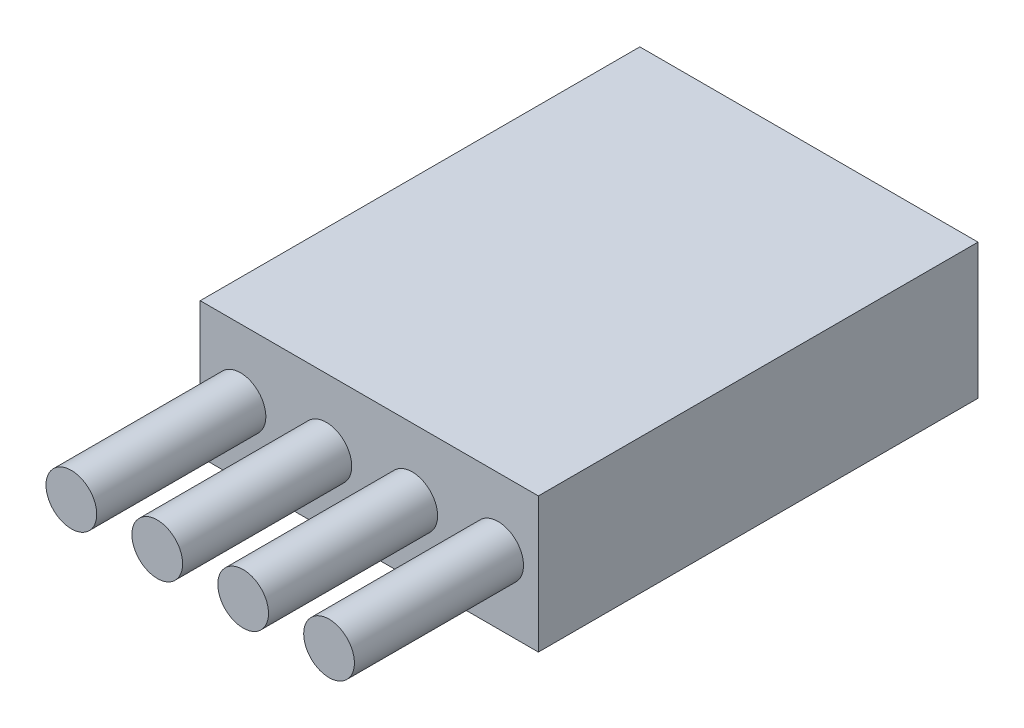
ISO-10303-21;
HEADER;
FILE_DESCRIPTION(('STEP AP214'),'2;1');
FILE_NAME('part.step','',(''),(''),'','','');
FILE_SCHEMA(('AUTOMOTIVE_DESIGN { 1 0 10303 214 1 1 1 1 }'));
ENDSEC;
DATA;
#1=APPLICATION_CONTEXT('core data for automotive mechanical design processes');
#2=APPLICATION_PROTOCOL_DEFINITION('international standard','automotive_design',2000,#1);
#3=PRODUCT_CONTEXT('',#1,'mechanical');
#4=PRODUCT('Part','Part','',(#3));
#5=PRODUCT_RELATED_PRODUCT_CATEGORY('part','',(#4));
#6=PRODUCT_DEFINITION_FORMATION('','',#4);
#7=PRODUCT_DEFINITION_CONTEXT('part definition',#1,'design');
#8=PRODUCT_DEFINITION('design','',#6,#7);
#9=PRODUCT_DEFINITION_SHAPE('','',#8);
#10=(LENGTH_UNIT() NAMED_UNIT(*) SI_UNIT(.MILLI.,.METRE.));
#11=(NAMED_UNIT(*) PLANE_ANGLE_UNIT() SI_UNIT($,.RADIAN.));
#12=(NAMED_UNIT(*) SI_UNIT($,.STERADIAN.) SOLID_ANGLE_UNIT());
#13=UNCERTAINTY_MEASURE_WITH_UNIT(LENGTH_MEASURE(1.E-05),#10,'distance_accuracy_value','');
#14=(GEOMETRIC_REPRESENTATION_CONTEXT(3) GLOBAL_UNCERTAINTY_ASSIGNED_CONTEXT((#13)) GLOBAL_UNIT_ASSIGNED_CONTEXT((#10,
#11,#12)) REPRESENTATION_CONTEXT('',''));
#15=CARTESIAN_POINT('',(0.,0.,0.));
#16=DIRECTION('',(0.,0.,1.));
#17=DIRECTION('',(1.,0.,0.));
#18=AXIS2_PLACEMENT_3D('',#15,#16,#17);
#19=CARTESIAN_POINT('',(5.,4.,6.5));
#20=DIRECTION('',(-1.,0.,0.));
#21=DIRECTION('',(0.,0.,1.));
#22=AXIS2_PLACEMENT_3D('',#19,#20,#21);
#23=PLANE('',#22);
#24=DIRECTION('',(0.,0.,-1.));
#25=VECTOR('',#24,1.);
#26=CARTESIAN_POINT('',(5.,0.,6.5));
#27=LINE('',#26,#25);
#28=CARTESIAN_POINT('',(5.,0.,6.5));
#29=VERTEX_POINT('',#28);
#30=CARTESIAN_POINT('',(5.,0.,-6.5));
#31=VERTEX_POINT('',#30);
#32=EDGE_CURVE('E102',#29,#31,#27,.T.);
#33=ORIENTED_EDGE('',*,*,#32,.T.);
#34=DIRECTION('',(0.,-1.,0.));
#35=VECTOR('',#34,1.);
#36=CARTESIAN_POINT('',(5.,4.,-6.5));
#37=LINE('',#36,#35);
#38=CARTESIAN_POINT('',(5.,4.,-6.5));
#39=VERTEX_POINT('',#38);
#40=EDGE_CURVE('E93',#39,#31,#37,.T.);
#41=ORIENTED_EDGE('',*,*,#40,.F.);
#42=DIRECTION('',(0.,0.,-1.));
#43=VECTOR('',#42,1.);
#44=CARTESIAN_POINT('',(5.,4.,6.5));
#45=LINE('',#44,#43);
#46=CARTESIAN_POINT('',(5.,4.,6.5));
#47=VERTEX_POINT('',#46);
#48=EDGE_CURVE('E87',#47,#39,#45,.T.);
#49=ORIENTED_EDGE('',*,*,#48,.F.);
#50=DIRECTION('',(0.,-1.,0.));
#51=VECTOR('',#50,1.);
#52=CARTESIAN_POINT('',(5.,4.,6.5));
#53=LINE('',#52,#51);
#54=EDGE_CURVE('E98',#47,#29,#53,.T.);
#55=ORIENTED_EDGE('',*,*,#54,.T.);
#56=EDGE_LOOP('',(#33,#41,#49,#55));
#57=FACE_BOUND('',#56,.T.);
#58=ADVANCED_FACE('F35',(#57),#23,.F.);
#59=CARTESIAN_POINT('',(-5.,4.,-6.5));
#60=DIRECTION('',(0.,0.,1.));
#61=DIRECTION('',(1.,0.,0.));
#62=AXIS2_PLACEMENT_3D('',#59,#60,#61);
#63=PLANE('',#62);
#64=DIRECTION('',(-1.,0.,0.));
#65=VECTOR('',#64,1.);
#66=CARTESIAN_POINT('',(-5.,0.,-6.5));
#67=LINE('',#66,#65);
#68=CARTESIAN_POINT('',(-5.,0.,-6.5));
#69=VERTEX_POINT('',#68);
#70=EDGE_CURVE('E92',#31,#69,#67,.T.);
#71=ORIENTED_EDGE('',*,*,#70,.T.);
#72=DIRECTION('',(0.,-1.,0.));
#73=VECTOR('',#72,1.);
#74=CARTESIAN_POINT('',(-5.,4.,-6.5));
#75=LINE('',#74,#73);
#76=CARTESIAN_POINT('',(-5.,4.,-6.5));
#77=VERTEX_POINT('',#76);
#78=EDGE_CURVE('E90',#77,#69,#75,.T.);
#79=ORIENTED_EDGE('',*,*,#78,.F.);
#80=DIRECTION('',(-1.,0.,0.));
#81=VECTOR('',#80,1.);
#82=CARTESIAN_POINT('',(-5.,4.,-6.5));
#83=LINE('',#82,#81);
#84=EDGE_CURVE('E82',#39,#77,#83,.T.);
#85=ORIENTED_EDGE('',*,*,#84,.F.);
#86=ORIENTED_EDGE('',*,*,#40,.T.);
#87=EDGE_LOOP('',(#71,#79,#85,#86));
#88=FACE_BOUND('',#87,.T.);
#89=ADVANCED_FACE('F91',(#88),#63,.F.);
#90=CARTESIAN_POINT('',(-5.,4.,6.5));
#91=DIRECTION('',(1.,0.,0.));
#92=DIRECTION('',(0.,0.,-1.));
#93=AXIS2_PLACEMENT_3D('',#90,#91,#92);
#94=PLANE('',#93);
#95=DIRECTION('',(0.,0.,1.));
#96=VECTOR('',#95,1.);
#97=CARTESIAN_POINT('',(-5.,0.,6.5));
#98=LINE('',#97,#96);
#99=CARTESIAN_POINT('',(-5.,0.,6.5));
#100=VERTEX_POINT('',#99);
#101=EDGE_CURVE('E68',#69,#100,#98,.T.);
#102=ORIENTED_EDGE('',*,*,#101,.T.);
#103=DIRECTION('',(0.,-1.,0.));
#104=VECTOR('',#103,1.);
#105=CARTESIAN_POINT('',(-5.,4.,6.5));
#106=LINE('',#105,#104);
#107=CARTESIAN_POINT('',(-5.,4.,6.5));
#108=VERTEX_POINT('',#107);
#109=EDGE_CURVE('E94',#108,#100,#106,.T.);
#110=ORIENTED_EDGE('',*,*,#109,.F.);
#111=DIRECTION('',(0.,0.,1.));
#112=VECTOR('',#111,1.);
#113=CARTESIAN_POINT('',(-5.,4.,6.5));
#114=LINE('',#113,#112);
#115=EDGE_CURVE('E85',#77,#108,#114,.T.);
#116=ORIENTED_EDGE('',*,*,#115,.F.);
#117=ORIENTED_EDGE('',*,*,#78,.T.);
#118=EDGE_LOOP('',(#102,#110,#116,#117));
#119=FACE_BOUND('',#118,.T.);
#120=ADVANCED_FACE('F96',(#119),#94,.F.);
#121=CARTESIAN_POINT('',(-5.,4.,6.5));
#122=DIRECTION('',(0.,0.,-1.));
#123=DIRECTION('',(-1.,0.,0.));
#124=AXIS2_PLACEMENT_3D('',#121,#122,#123);
#125=PLANE('',#124);
#126=CARTESIAN_POINT('',(3.81,2.,6.5));
#127=DIRECTION('',(0.,0.,-1.));
#128=DIRECTION('',(-1.,0.,0.));
#129=AXIS2_PLACEMENT_3D('',#126,#127,#128);
#130=CIRCLE('',#129,0.75);
#131=CARTESIAN_POINT('',(3.06,2.,6.5));
#132=VERTEX_POINT('',#131);
#133=EDGE_CURVE('E11',#132,#132,#130,.F.);
#134=ORIENTED_EDGE('',*,*,#133,.F.);
#135=EDGE_LOOP('',(#134));
#136=FACE_BOUND('',#135,.T.);
#137=CARTESIAN_POINT('',(1.27,2.,6.5));
#138=DIRECTION('',(0.,0.,-1.));
#139=DIRECTION('',(-1.,0.,0.));
#140=AXIS2_PLACEMENT_3D('',#137,#138,#139);
#141=CIRCLE('',#140,0.75);
#142=CARTESIAN_POINT('',(0.520000000000003,2.,6.5));
#143=VERTEX_POINT('',#142);
#144=EDGE_CURVE('E43',#143,#143,#141,.F.);
#145=ORIENTED_EDGE('',*,*,#144,.F.);
#146=EDGE_LOOP('',(#145));
#147=FACE_BOUND('',#146,.T.);
#148=CARTESIAN_POINT('',(-1.27,2.,6.5));
#149=DIRECTION('',(0.,0.,-1.));
#150=DIRECTION('',(-1.,0.,0.));
#151=AXIS2_PLACEMENT_3D('',#148,#149,#150);
#152=CIRCLE('',#151,0.75);
#153=CARTESIAN_POINT('',(-2.02,2.,6.5));
#154=VERTEX_POINT('',#153);
#155=EDGE_CURVE('E115',#154,#154,#152,.F.);
#156=ORIENTED_EDGE('',*,*,#155,.F.);
#157=EDGE_LOOP('',(#156));
#158=FACE_BOUND('',#157,.T.);
#159=CARTESIAN_POINT('',(-3.81,2.,6.5));
#160=DIRECTION('',(0.,0.,-1.));
#161=DIRECTION('',(-1.,0.,0.));
#162=AXIS2_PLACEMENT_3D('',#159,#160,#161);
#163=CIRCLE('',#162,0.75);
#164=CARTESIAN_POINT('',(-4.56,2.,6.5));
#165=VERTEX_POINT('',#164);
#166=EDGE_CURVE('E112',#165,#165,#163,.F.);
#167=ORIENTED_EDGE('',*,*,#166,.F.);
#168=EDGE_LOOP('',(#167));
#169=FACE_BOUND('',#168,.T.);
#170=DIRECTION('',(1.,0.,0.));
#171=VECTOR('',#170,1.);
#172=CARTESIAN_POINT('',(-5.,0.,6.5));
#173=LINE('',#172,#171);
#174=EDGE_CURVE('E74',#100,#29,#173,.T.);
#175=ORIENTED_EDGE('',*,*,#174,.T.);
#176=ORIENTED_EDGE('',*,*,#54,.F.);
#177=DIRECTION('',(1.,0.,0.));
#178=VECTOR('',#177,1.);
#179=CARTESIAN_POINT('',(-5.,4.,6.5));
#180=LINE('',#179,#178);
#181=EDGE_CURVE('E51',#108,#47,#180,.T.);
#182=ORIENTED_EDGE('',*,*,#181,.F.);
#183=ORIENTED_EDGE('',*,*,#109,.T.);
#184=EDGE_LOOP('',(#175,#176,#182,#183));
#185=FACE_BOUND('',#184,.T.);
#186=ADVANCED_FACE('F122',(#136,#147,#158,#169,#185),#125,.F.);
#187=CARTESIAN_POINT('',(0.,4.,0.));
#188=DIRECTION('',(0.,-1.,0.));
#189=DIRECTION('',(0.,0.,-1.));
#190=AXIS2_PLACEMENT_3D('',#187,#188,#189);
#191=PLANE('',#190);
#192=ORIENTED_EDGE('',*,*,#48,.T.);
#193=ORIENTED_EDGE('',*,*,#84,.T.);
#194=ORIENTED_EDGE('',*,*,#115,.T.);
#195=ORIENTED_EDGE('',*,*,#181,.T.);
#196=EDGE_LOOP('',(#192,#193,#194,#195));
#197=FACE_BOUND('',#196,.T.);
#198=ADVANCED_FACE('F83',(#197),#191,.F.);
#199=CARTESIAN_POINT('',(0.,0.,0.));
#200=DIRECTION('',(0.,-1.,0.));
#201=DIRECTION('',(0.,0.,-1.));
#202=AXIS2_PLACEMENT_3D('',#199,#200,#201);
#203=PLANE('',#202);
#204=ORIENTED_EDGE('',*,*,#32,.F.);
#205=ORIENTED_EDGE('',*,*,#174,.F.);
#206=ORIENTED_EDGE('',*,*,#101,.F.);
#207=ORIENTED_EDGE('',*,*,#70,.F.);
#208=EDGE_LOOP('',(#204,#205,#206,#207));
#209=FACE_BOUND('',#208,.T.);
#210=ADVANCED_FACE('F134',(#209),#203,.T.);
#211=CARTESIAN_POINT('',(-3.81,2.,11.5));
#212=DIRECTION('',(0.,0.,-1.));
#213=DIRECTION('',(-1.,0.,0.));
#214=AXIS2_PLACEMENT_3D('',#211,#212,#213);
#215=CYLINDRICAL_SURFACE('',#214,0.75);
#216=CARTESIAN_POINT('',(-3.81,2.,11.5));
#217=DIRECTION('',(0.,0.,1.));
#218=DIRECTION('',(1.,0.,0.));
#219=AXIS2_PLACEMENT_3D('',#216,#217,#218);
#220=CIRCLE('',#219,0.75);
#221=CARTESIAN_POINT('',(-3.06,2.,11.5));
#222=VERTEX_POINT('',#221);
#223=EDGE_CURVE('E105',#222,#222,#220,.T.);
#224=ORIENTED_EDGE('',*,*,#223,.F.);
#225=EDGE_LOOP('',(#224));
#226=FACE_BOUND('',#225,.T.);
#227=ORIENTED_EDGE('',*,*,#166,.T.);
#228=EDGE_LOOP('',(#227));
#229=FACE_BOUND('',#228,.T.);
#230=ADVANCED_FACE('F131',(#226,#229),#215,.T.);
#231=CARTESIAN_POINT('',(-3.81,2.,11.5));
#232=DIRECTION('',(0.,0.,1.));
#233=DIRECTION('',(1.,0.,0.));
#234=AXIS2_PLACEMENT_3D('',#231,#232,#233);
#235=PLANE('',#234);
#236=ORIENTED_EDGE('',*,*,#223,.T.);
#237=EDGE_LOOP('',(#236));
#238=FACE_BOUND('',#237,.T.);
#239=ADVANCED_FACE('F133',(#238),#235,.T.);
#240=CARTESIAN_POINT('',(-1.27,2.,11.5));
#241=DIRECTION('',(0.,0.,-1.));
#242=DIRECTION('',(-1.,0.,0.));
#243=AXIS2_PLACEMENT_3D('',#240,#241,#242);
#244=CYLINDRICAL_SURFACE('',#243,0.75);
#245=CARTESIAN_POINT('',(-1.27,2.,11.5));
#246=DIRECTION('',(0.,0.,1.));
#247=DIRECTION('',(1.,0.,0.));
#248=AXIS2_PLACEMENT_3D('',#245,#246,#247);
#249=CIRCLE('',#248,0.75);
#250=CARTESIAN_POINT('',(-0.519999999999997,2.,11.5));
#251=VERTEX_POINT('',#250);
#252=EDGE_CURVE('E157',#251,#251,#249,.T.);
#253=ORIENTED_EDGE('',*,*,#252,.F.);
#254=EDGE_LOOP('',(#253));
#255=FACE_BOUND('',#254,.T.);
#256=ORIENTED_EDGE('',*,*,#155,.T.);
#257=EDGE_LOOP('',(#256));
#258=FACE_BOUND('',#257,.T.);
#259=ADVANCED_FACE('F141',(#255,#258),#244,.T.);
#260=CARTESIAN_POINT('',(-1.27,2.,11.5));
#261=DIRECTION('',(0.,0.,1.));
#262=DIRECTION('',(1.,0.,0.));
#263=AXIS2_PLACEMENT_3D('',#260,#261,#262);
#264=PLANE('',#263);
#265=ORIENTED_EDGE('',*,*,#252,.T.);
#266=EDGE_LOOP('',(#265));
#267=FACE_BOUND('',#266,.T.);
#268=ADVANCED_FACE('F185',(#267),#264,.T.);
#269=CARTESIAN_POINT('',(1.27,2.,11.5));
#270=DIRECTION('',(0.,0.,-1.));
#271=DIRECTION('',(-1.,0.,0.));
#272=AXIS2_PLACEMENT_3D('',#269,#270,#271);
#273=CYLINDRICAL_SURFACE('',#272,0.75);
#274=CARTESIAN_POINT('',(1.27,2.,11.5));
#275=DIRECTION('',(0.,0.,1.));
#276=DIRECTION('',(1.,0.,0.));
#277=AXIS2_PLACEMENT_3D('',#274,#275,#276);
#278=CIRCLE('',#277,0.75);
#279=CARTESIAN_POINT('',(2.02,2.,11.5));
#280=VERTEX_POINT('',#279);
#281=EDGE_CURVE('E160',#280,#280,#278,.T.);
#282=ORIENTED_EDGE('',*,*,#281,.F.);
#283=EDGE_LOOP('',(#282));
#284=FACE_BOUND('',#283,.T.);
#285=ORIENTED_EDGE('',*,*,#144,.T.);
#286=EDGE_LOOP('',(#285));
#287=FACE_BOUND('',#286,.T.);
#288=ADVANCED_FACE('F120',(#284,#287),#273,.T.);
#289=CARTESIAN_POINT('',(1.27,2.,11.5));
#290=DIRECTION('',(0.,0.,1.));
#291=DIRECTION('',(1.,0.,0.));
#292=AXIS2_PLACEMENT_3D('',#289,#290,#291);
#293=PLANE('',#292);
#294=ORIENTED_EDGE('',*,*,#281,.T.);
#295=EDGE_LOOP('',(#294));
#296=FACE_BOUND('',#295,.T.);
#297=ADVANCED_FACE('F172',(#296),#293,.T.);
#298=CARTESIAN_POINT('',(3.81,2.,11.5));
#299=DIRECTION('',(0.,0.,-1.));
#300=DIRECTION('',(-1.,0.,0.));
#301=AXIS2_PLACEMENT_3D('',#298,#299,#300);
#302=CYLINDRICAL_SURFACE('',#301,0.75);
#303=CARTESIAN_POINT('',(3.81,2.,11.5));
#304=DIRECTION('',(0.,0.,1.));
#305=DIRECTION('',(1.,0.,0.));
#306=AXIS2_PLACEMENT_3D('',#303,#304,#305);
#307=CIRCLE('',#306,0.75);
#308=CARTESIAN_POINT('',(4.56,2.,11.5));
#309=VERTEX_POINT('',#308);
#310=EDGE_CURVE('E163',#309,#309,#307,.T.);
#311=ORIENTED_EDGE('',*,*,#310,.F.);
#312=EDGE_LOOP('',(#311));
#313=FACE_BOUND('',#312,.T.);
#314=ORIENTED_EDGE('',*,*,#133,.T.);
#315=EDGE_LOOP('',(#314));
#316=FACE_BOUND('',#315,.T.);
#317=ADVANCED_FACE('F169',(#313,#316),#302,.T.);
#318=CARTESIAN_POINT('',(3.81,2.,11.5));
#319=DIRECTION('',(0.,0.,1.));
#320=DIRECTION('',(1.,0.,0.));
#321=AXIS2_PLACEMENT_3D('',#318,#319,#320);
#322=PLANE('',#321);
#323=ORIENTED_EDGE('',*,*,#310,.T.);
#324=EDGE_LOOP('',(#323));
#325=FACE_BOUND('',#324,.T.);
#326=ADVANCED_FACE('F167',(#325),#322,.T.);
#327=CLOSED_SHELL('',(#58,#89,#120,#186,#198,#210,#230,#239,#259,#268,#288,#297,#317,#326));
#328=MANIFOLD_SOLID_BREP('B2',#327);
#329=ADVANCED_BREP_SHAPE_REPRESENTATION('',(#18,#328),#14);
#330=SHAPE_DEFINITION_REPRESENTATION(#9,#329);
ENDSEC;
END-ISO-10303-21;
